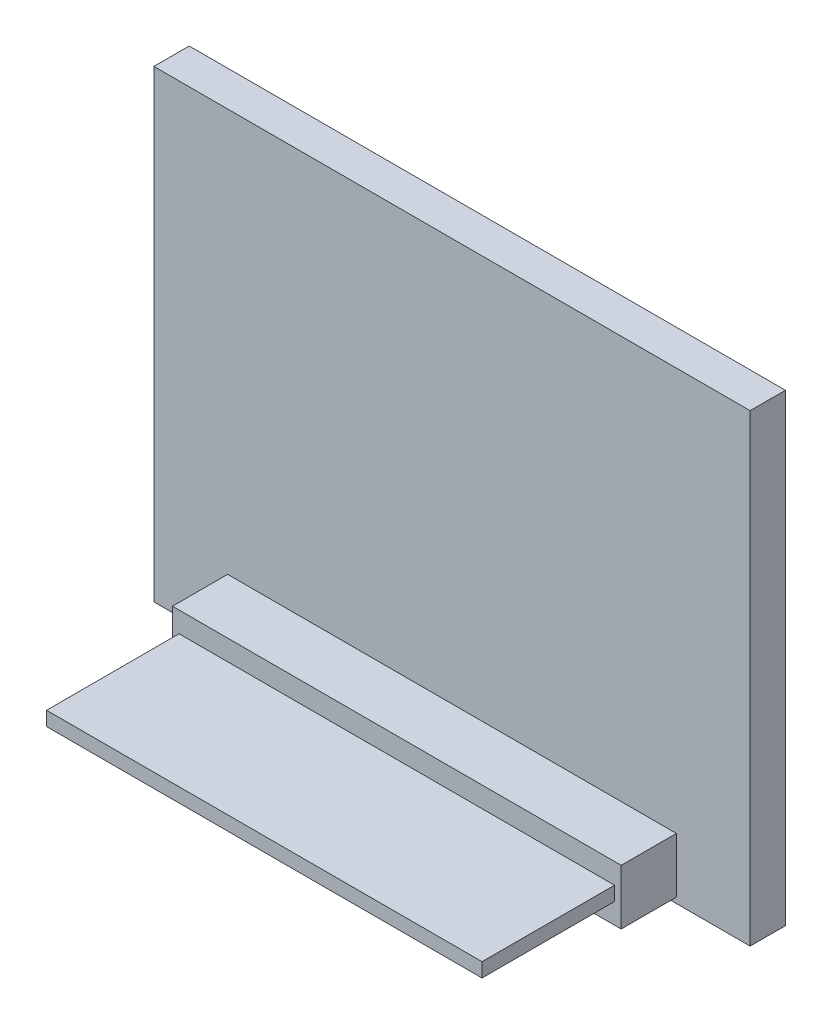
ISO-10303-21;
HEADER;
FILE_DESCRIPTION(('STEP AP214'),'2;1');
FILE_NAME('part.step','',(''),(''),'','','');
FILE_SCHEMA(('AUTOMOTIVE_DESIGN { 1 0 10303 214 1 1 1 1 }'));
ENDSEC;
DATA;
#1=APPLICATION_CONTEXT('core data for automotive mechanical design processes');
#2=APPLICATION_PROTOCOL_DEFINITION('international standard','automotive_design',2000,#1);
#3=PRODUCT_CONTEXT('',#1,'mechanical');
#4=PRODUCT('Part','Part','',(#3));
#5=PRODUCT_RELATED_PRODUCT_CATEGORY('part','',(#4));
#6=PRODUCT_DEFINITION_FORMATION('','',#4);
#7=PRODUCT_DEFINITION_CONTEXT('part definition',#1,'design');
#8=PRODUCT_DEFINITION('design','',#6,#7);
#9=PRODUCT_DEFINITION_SHAPE('','',#8);
#10=(LENGTH_UNIT() NAMED_UNIT(*) SI_UNIT(.MILLI.,.METRE.));
#11=(NAMED_UNIT(*) PLANE_ANGLE_UNIT() SI_UNIT($,.RADIAN.));
#12=(NAMED_UNIT(*) SI_UNIT($,.STERADIAN.) SOLID_ANGLE_UNIT());
#13=UNCERTAINTY_MEASURE_WITH_UNIT(LENGTH_MEASURE(1.E-05),#10,'distance_accuracy_value','');
#14=(GEOMETRIC_REPRESENTATION_CONTEXT(3) GLOBAL_UNCERTAINTY_ASSIGNED_CONTEXT((#13)) GLOBAL_UNIT_ASSIGNED_CONTEXT((#10,
#11,#12)) REPRESENTATION_CONTEXT('',''));
#15=CARTESIAN_POINT('',(0.,0.,0.));
#16=DIRECTION('',(0.,0.,1.));
#17=DIRECTION('',(1.,0.,0.));
#18=AXIS2_PLACEMENT_3D('',#15,#16,#17);
#19=CARTESIAN_POINT('',(-9.86,-9.32,10.1));
#20=DIRECTION('',(0.,0.,1.));
#21=DIRECTION('',(1.,0.,0.));
#22=AXIS2_PLACEMENT_3D('',#19,#20,#21);
#23=PLANE('',#22);
#24=DIRECTION('',(0.,1.,0.));
#25=VECTOR('',#24,1.);
#26=CARTESIAN_POINT('',(-9.86,-9.32,10.1));
#27=LINE('',#26,#25);
#28=CARTESIAN_POINT('',(-9.86,-9.32,10.1));
#29=VERTEX_POINT('',#28);
#30=CARTESIAN_POINT('',(-9.86,-8.68,10.1));
#31=VERTEX_POINT('',#30);
#32=EDGE_CURVE('E11',#29,#31,#27,.T.);
#33=ORIENTED_EDGE('',*,*,#32,.F.);
#34=DIRECTION('',(1.,0.,0.));
#35=VECTOR('',#34,1.);
#36=CARTESIAN_POINT('',(-9.86,-9.32,10.1));
#37=LINE('',#36,#35);
#38=CARTESIAN_POINT('',(9.86,-9.32,10.1));
#39=VERTEX_POINT('',#38);
#40=EDGE_CURVE('E405',#29,#39,#37,.T.);
#41=ORIENTED_EDGE('',*,*,#40,.T.);
#42=DIRECTION('',(0.,1.,0.));
#43=VECTOR('',#42,1.);
#44=CARTESIAN_POINT('',(9.86,-9.32,10.1));
#45=LINE('',#44,#43);
#46=CARTESIAN_POINT('',(9.86,-8.68,10.1));
#47=VERTEX_POINT('',#46);
#48=EDGE_CURVE('E308',#39,#47,#45,.T.);
#49=ORIENTED_EDGE('',*,*,#48,.T.);
#50=DIRECTION('',(1.,0.,0.));
#51=VECTOR('',#50,1.);
#52=CARTESIAN_POINT('',(-9.86,-8.68,10.1));
#53=LINE('',#52,#51);
#54=EDGE_CURVE('E25',#31,#47,#53,.T.);
#55=ORIENTED_EDGE('',*,*,#54,.F.);
#56=EDGE_LOOP('',(#33,#41,#49,#55));
#57=FACE_BOUND('',#56,.T.);
#58=ADVANCED_FACE('F17',(#57),#23,.T.);
#59=CARTESIAN_POINT('',(-9.86,-9.32,-3.));
#60=DIRECTION('',(1.,0.,0.));
#61=DIRECTION('',(0.,1.,0.));
#62=AXIS2_PLACEMENT_3D('',#59,#60,#61);
#63=PLANE('',#62);
#64=ORIENTED_EDGE('',*,*,#32,.T.);
#65=DIRECTION('',(0.,0.,1.));
#66=VECTOR('',#65,1.);
#67=CARTESIAN_POINT('',(-9.86,-8.68,-3.));
#68=LINE('',#67,#66);
#69=CARTESIAN_POINT('',(-9.86,-8.68,4.1));
#70=VERTEX_POINT('',#69);
#71=EDGE_CURVE('E271',#70,#31,#68,.T.);
#72=ORIENTED_EDGE('',*,*,#71,.F.);
#73=DIRECTION('',(0.,1.,0.));
#74=VECTOR('',#73,1.);
#75=CARTESIAN_POINT('',(-9.86,-9.785,4.1));
#76=LINE('',#75,#74);
#77=CARTESIAN_POINT('',(-9.86,-9.32,4.1));
#78=VERTEX_POINT('',#77);
#79=EDGE_CURVE('E277',#78,#70,#76,.T.);
#80=ORIENTED_EDGE('',*,*,#79,.F.);
#81=DIRECTION('',(0.,0.,1.));
#82=VECTOR('',#81,1.);
#83=CARTESIAN_POINT('',(-9.86,-9.32,-3.));
#84=LINE('',#83,#82);
#85=EDGE_CURVE('E409',#78,#29,#84,.T.);
#86=ORIENTED_EDGE('',*,*,#85,.T.);
#87=EDGE_LOOP('',(#64,#72,#80,#86));
#88=FACE_BOUND('',#87,.T.);
#89=ADVANCED_FACE('F419',(#88),#63,.F.);
#90=CARTESIAN_POINT('',(-9.86,-8.68,-3.));
#91=DIRECTION('',(0.,1.,0.));
#92=DIRECTION('',(1.,0.,0.));
#93=AXIS2_PLACEMENT_3D('',#90,#91,#92);
#94=PLANE('',#93);
#95=DIRECTION('',(0.,0.,1.));
#96=VECTOR('',#95,1.);
#97=CARTESIAN_POINT('',(9.86,-8.68,-3.));
#98=LINE('',#97,#96);
#99=CARTESIAN_POINT('',(9.86,-8.68,4.1));
#100=VERTEX_POINT('',#99);
#101=EDGE_CURVE('E304',#100,#47,#98,.T.);
#102=ORIENTED_EDGE('',*,*,#101,.F.);
#103=DIRECTION('',(-1.,0.,0.));
#104=VECTOR('',#103,1.);
#105=CARTESIAN_POINT('',(-10.01,-8.68,4.1));
#106=LINE('',#105,#104);
#107=EDGE_CURVE('E272',#100,#70,#106,.T.);
#108=ORIENTED_EDGE('',*,*,#107,.T.);
#109=ORIENTED_EDGE('',*,*,#71,.T.);
#110=ORIENTED_EDGE('',*,*,#54,.T.);
#111=EDGE_LOOP('',(#102,#108,#109,#110));
#112=FACE_BOUND('',#111,.T.);
#113=ADVANCED_FACE('F416',(#112),#94,.T.);
#114=CARTESIAN_POINT('',(9.86,-9.32,-3.));
#115=DIRECTION('',(1.,0.,0.));
#116=DIRECTION('',(0.,1.,0.));
#117=AXIS2_PLACEMENT_3D('',#114,#115,#116);
#118=PLANE('',#117);
#119=DIRECTION('',(0.,0.,1.));
#120=VECTOR('',#119,1.);
#121=CARTESIAN_POINT('',(9.86,-9.32,-3.));
#122=LINE('',#121,#120);
#123=CARTESIAN_POINT('',(9.86,-9.32,4.1));
#124=VERTEX_POINT('',#123);
#125=EDGE_CURVE('E309',#124,#39,#122,.T.);
#126=ORIENTED_EDGE('',*,*,#125,.F.);
#127=DIRECTION('',(0.,1.,0.));
#128=VECTOR('',#127,1.);
#129=CARTESIAN_POINT('',(9.86,-9.785,4.1));
#130=LINE('',#129,#128);
#131=EDGE_CURVE('E276',#124,#100,#130,.T.);
#132=ORIENTED_EDGE('',*,*,#131,.T.);
#133=ORIENTED_EDGE('',*,*,#101,.T.);
#134=ORIENTED_EDGE('',*,*,#48,.F.);
#135=EDGE_LOOP('',(#126,#132,#133,#134));
#136=FACE_BOUND('',#135,.T.);
#137=ADVANCED_FACE('F430',(#136),#118,.T.);
#138=CARTESIAN_POINT('',(-9.86,-9.32,-3.));
#139=DIRECTION('',(0.,1.,0.));
#140=DIRECTION('',(1.,0.,0.));
#141=AXIS2_PLACEMENT_3D('',#138,#139,#140);
#142=PLANE('',#141);
#143=ORIENTED_EDGE('',*,*,#40,.F.);
#144=ORIENTED_EDGE('',*,*,#85,.F.);
#145=DIRECTION('',(-1.,0.,0.));
#146=VECTOR('',#145,1.);
#147=CARTESIAN_POINT('',(-10.01,-9.32,4.1));
#148=LINE('',#147,#146);
#149=EDGE_CURVE('E395',#124,#78,#148,.T.);
#150=ORIENTED_EDGE('',*,*,#149,.F.);
#151=ORIENTED_EDGE('',*,*,#125,.T.);
#152=EDGE_LOOP('',(#143,#144,#150,#151));
#153=FACE_BOUND('',#152,.T.);
#154=ADVANCED_FACE('F427',(#153),#142,.F.);
#155=CARTESIAN_POINT('',(-2.6,-1.9,-1.1));
#156=DIRECTION('',(0.,0.,1.));
#157=DIRECTION('',(1.,0.,0.));
#158=AXIS2_PLACEMENT_3D('',#155,#156,#157);
#159=PLANE('',#158);
#160=DIRECTION('',(1.,0.,0.));
#161=VECTOR('',#160,1.);
#162=CARTESIAN_POINT('',(-2.6,1.9,-1.1));
#163=LINE('',#162,#161);
#164=CARTESIAN_POINT('',(-2.6,1.9,-1.1));
#165=VERTEX_POINT('',#164);
#166=CARTESIAN_POINT('',(2.6,1.9,-1.1));
#167=VERTEX_POINT('',#166);
#168=EDGE_CURVE('E263',#165,#167,#163,.T.);
#169=ORIENTED_EDGE('',*,*,#168,.T.);
#170=DIRECTION('',(0.,1.,0.));
#171=VECTOR('',#170,1.);
#172=CARTESIAN_POINT('',(2.6,-1.9,-1.1));
#173=LINE('',#172,#171);
#174=CARTESIAN_POINT('',(2.6,-1.9,-1.1));
#175=VERTEX_POINT('',#174);
#176=EDGE_CURVE('E392',#175,#167,#173,.T.);
#177=ORIENTED_EDGE('',*,*,#176,.F.);
#178=DIRECTION('',(1.,0.,0.));
#179=VECTOR('',#178,1.);
#180=CARTESIAN_POINT('',(-2.6,-1.9,-1.1));
#181=LINE('',#180,#179);
#182=CARTESIAN_POINT('',(-2.6,-1.9,-1.1));
#183=VERTEX_POINT('',#182);
#184=EDGE_CURVE('E323',#183,#175,#181,.T.);
#185=ORIENTED_EDGE('',*,*,#184,.F.);
#186=DIRECTION('',(0.,1.,0.));
#187=VECTOR('',#186,1.);
#188=CARTESIAN_POINT('',(-2.6,-1.9,-1.1));
#189=LINE('',#188,#187);
#190=EDGE_CURVE('E264',#183,#165,#189,.T.);
#191=ORIENTED_EDGE('',*,*,#190,.T.);
#192=EDGE_LOOP('',(#169,#177,#185,#191));
#193=FACE_BOUND('',#192,.T.);
#194=ADVANCED_FACE('F438',(#193),#159,.F.);
#195=CARTESIAN_POINT('',(-9.86,-9.32,-3.));
#196=DIRECTION('',(0.,0.,1.));
#197=DIRECTION('',(1.,0.,0.));
#198=AXIS2_PLACEMENT_3D('',#195,#196,#197);
#199=PLANE('',#198);
#200=DIRECTION('',(1.,0.,0.));
#201=VECTOR('',#200,1.);
#202=CARTESIAN_POINT('',(-9.86,-8.68,-3.));
#203=LINE('',#202,#201);
#204=CARTESIAN_POINT('',(-9.86,-8.68,-3.));
#205=VERTEX_POINT('',#204);
#206=CARTESIAN_POINT('',(9.86,-8.68,-3.));
#207=VERTEX_POINT('',#206);
#208=EDGE_CURVE('E361',#205,#207,#203,.T.);
#209=ORIENTED_EDGE('',*,*,#208,.T.);
#210=DIRECTION('',(0.,1.,0.));
#211=VECTOR('',#210,1.);
#212=CARTESIAN_POINT('',(9.86,-9.32,-3.));
#213=LINE('',#212,#211);
#214=CARTESIAN_POINT('',(9.86,-9.32,-3.));
#215=VERTEX_POINT('',#214);
#216=EDGE_CURVE('E368',#215,#207,#213,.T.);
#217=ORIENTED_EDGE('',*,*,#216,.F.);
#218=DIRECTION('',(1.,0.,0.));
#219=VECTOR('',#218,1.);
#220=CARTESIAN_POINT('',(-9.86,-9.32,-3.));
#221=LINE('',#220,#219);
#222=CARTESIAN_POINT('',(-9.86,-9.32,-3.));
#223=VERTEX_POINT('',#222);
#224=EDGE_CURVE('E356',#223,#215,#221,.T.);
#225=ORIENTED_EDGE('',*,*,#224,.F.);
#226=DIRECTION('',(0.,1.,0.));
#227=VECTOR('',#226,1.);
#228=CARTESIAN_POINT('',(-9.86,-9.32,-3.));
#229=LINE('',#228,#227);
#230=EDGE_CURVE('E378',#223,#205,#229,.T.);
#231=ORIENTED_EDGE('',*,*,#230,.T.);
#232=EDGE_LOOP('',(#209,#217,#225,#231));
#233=FACE_BOUND('',#232,.T.);
#234=ADVANCED_FACE('F484',(#233),#199,.F.);
#235=CARTESIAN_POINT('',(-10.16,-10.25,4.1));
#236=DIRECTION('',(0.,0.,1.));
#237=DIRECTION('',(1.,0.,0.));
#238=AXIS2_PLACEMENT_3D('',#235,#236,#237);
#239=PLANE('',#238);
#240=ORIENTED_EDGE('',*,*,#149,.T.);
#241=ORIENTED_EDGE('',*,*,#79,.T.);
#242=ORIENTED_EDGE('',*,*,#107,.F.);
#243=ORIENTED_EDGE('',*,*,#131,.F.);
#244=EDGE_LOOP('',(#240,#241,#242,#243));
#245=FACE_BOUND('',#244,.T.);
#246=DIRECTION('',(0.,1.,0.));
#247=VECTOR('',#246,1.);
#248=CARTESIAN_POINT('',(-10.16,-10.25,4.1));
#249=LINE('',#248,#247);
#250=CARTESIAN_POINT('',(-10.16,-10.25,4.1));
#251=VERTEX_POINT('',#250);
#252=CARTESIAN_POINT('',(-10.16,-7.75,4.1));
#253=VERTEX_POINT('',#252);
#254=EDGE_CURVE('E336',#251,#253,#249,.T.);
#255=ORIENTED_EDGE('',*,*,#254,.F.);
#256=DIRECTION('',(1.,0.,0.));
#257=VECTOR('',#256,1.);
#258=CARTESIAN_POINT('',(-10.16,-10.25,4.1));
#259=LINE('',#258,#257);
#260=CARTESIAN_POINT('',(10.16,-10.25,4.1));
#261=VERTEX_POINT('',#260);
#262=EDGE_CURVE('E209',#251,#261,#259,.T.);
#263=ORIENTED_EDGE('',*,*,#262,.T.);
#264=DIRECTION('',(0.,1.,0.));
#265=VECTOR('',#264,1.);
#266=CARTESIAN_POINT('',(10.16,-10.25,4.1));
#267=LINE('',#266,#265);
#268=CARTESIAN_POINT('',(10.16,-7.75,4.1));
#269=VERTEX_POINT('',#268);
#270=EDGE_CURVE('E205',#261,#269,#267,.T.);
#271=ORIENTED_EDGE('',*,*,#270,.T.);
#272=DIRECTION('',(1.,0.,0.));
#273=VECTOR('',#272,1.);
#274=CARTESIAN_POINT('',(-10.16,-7.75,4.1));
#275=LINE('',#274,#273);
#276=EDGE_CURVE('E350',#253,#269,#275,.T.);
#277=ORIENTED_EDGE('',*,*,#276,.F.);
#278=EDGE_LOOP('',(#255,#263,#271,#277));
#279=FACE_BOUND('',#278,.T.);
#280=ADVANCED_FACE('F424',(#245,#279),#239,.T.);
#281=CARTESIAN_POINT('',(2.6,-1.9,-1.1));
#282=DIRECTION('',(1.,0.,0.));
#283=DIRECTION('',(0.,1.,0.));
#284=AXIS2_PLACEMENT_3D('',#281,#282,#283);
#285=PLANE('',#284);
#286=DIRECTION('',(0.,0.,1.));
#287=VECTOR('',#286,1.);
#288=CARTESIAN_POINT('',(2.6,-1.9,-1.1));
#289=LINE('',#288,#287);
#290=CARTESIAN_POINT('',(2.6,-1.9,0.));
#291=VERTEX_POINT('',#290);
#292=EDGE_CURVE('E320',#175,#291,#289,.T.);
#293=ORIENTED_EDGE('',*,*,#292,.F.);
#294=ORIENTED_EDGE('',*,*,#176,.T.);
#295=DIRECTION('',(0.,0.,1.));
#296=VECTOR('',#295,1.);
#297=CARTESIAN_POINT('',(2.6,1.9,-1.1));
#298=LINE('',#297,#296);
#299=CARTESIAN_POINT('',(2.6,1.9,0.));
#300=VERTEX_POINT('',#299);
#301=EDGE_CURVE('E324',#167,#300,#298,.T.);
#302=ORIENTED_EDGE('',*,*,#301,.T.);
#303=DIRECTION('',(0.,1.,0.));
#304=VECTOR('',#303,1.);
#305=CARTESIAN_POINT('',(2.6,-1.9,0.));
#306=LINE('',#305,#304);
#307=EDGE_CURVE('E290',#291,#300,#306,.T.);
#308=ORIENTED_EDGE('',*,*,#307,.F.);
#309=EDGE_LOOP('',(#293,#294,#302,#308));
#310=FACE_BOUND('',#309,.T.);
#311=ADVANCED_FACE('F477',(#310),#285,.T.);
#312=CARTESIAN_POINT('',(-2.6,-1.9,-1.1));
#313=DIRECTION('',(0.,1.,0.));
#314=DIRECTION('',(1.,0.,0.));
#315=AXIS2_PLACEMENT_3D('',#312,#313,#314);
#316=PLANE('',#315);
#317=ORIENTED_EDGE('',*,*,#292,.T.);
#318=DIRECTION('',(1.,0.,0.));
#319=VECTOR('',#318,1.);
#320=CARTESIAN_POINT('',(-2.6,-1.9,0.));
#321=LINE('',#320,#319);
#322=CARTESIAN_POINT('',(-2.6,-1.9,0.));
#323=VERTEX_POINT('',#322);
#324=EDGE_CURVE('E286',#323,#291,#321,.T.);
#325=ORIENTED_EDGE('',*,*,#324,.F.);
#326=DIRECTION('',(0.,0.,1.));
#327=VECTOR('',#326,1.);
#328=CARTESIAN_POINT('',(-2.6,-1.9,-1.1));
#329=LINE('',#328,#327);
#330=EDGE_CURVE('E260',#183,#323,#329,.T.);
#331=ORIENTED_EDGE('',*,*,#330,.F.);
#332=ORIENTED_EDGE('',*,*,#184,.T.);
#333=EDGE_LOOP('',(#317,#325,#331,#332));
#334=FACE_BOUND('',#333,.T.);
#335=ADVANCED_FACE('F473',(#334),#316,.F.);
#336=CARTESIAN_POINT('',(-2.6,1.9,-1.1));
#337=DIRECTION('',(0.,1.,0.));
#338=DIRECTION('',(1.,0.,0.));
#339=AXIS2_PLACEMENT_3D('',#336,#337,#338);
#340=PLANE('',#339);
#341=ORIENTED_EDGE('',*,*,#168,.F.);
#342=DIRECTION('',(0.,0.,1.));
#343=VECTOR('',#342,1.);
#344=CARTESIAN_POINT('',(-2.6,1.9,-1.1));
#345=LINE('',#344,#343);
#346=CARTESIAN_POINT('',(-2.6,1.9,0.));
#347=VERTEX_POINT('',#346);
#348=EDGE_CURVE('E236',#165,#347,#345,.T.);
#349=ORIENTED_EDGE('',*,*,#348,.T.);
#350=DIRECTION('',(1.,0.,0.));
#351=VECTOR('',#350,1.);
#352=CARTESIAN_POINT('',(-2.6,1.9,0.));
#353=LINE('',#352,#351);
#354=EDGE_CURVE('E328',#347,#300,#353,.T.);
#355=ORIENTED_EDGE('',*,*,#354,.T.);
#356=ORIENTED_EDGE('',*,*,#301,.F.);
#357=EDGE_LOOP('',(#341,#349,#355,#356));
#358=FACE_BOUND('',#357,.T.);
#359=ADVANCED_FACE('F469',(#358),#340,.T.);
#360=CARTESIAN_POINT('',(-2.6,-1.9,-1.1));
#361=DIRECTION('',(1.,0.,0.));
#362=DIRECTION('',(0.,1.,0.));
#363=AXIS2_PLACEMENT_3D('',#360,#361,#362);
#364=PLANE('',#363);
#365=DIRECTION('',(0.,1.,0.));
#366=VECTOR('',#365,1.);
#367=CARTESIAN_POINT('',(-2.6,-1.9,0.));
#368=LINE('',#367,#366);
#369=EDGE_CURVE('E332',#323,#347,#368,.T.);
#370=ORIENTED_EDGE('',*,*,#369,.T.);
#371=ORIENTED_EDGE('',*,*,#348,.F.);
#372=ORIENTED_EDGE('',*,*,#190,.F.);
#373=ORIENTED_EDGE('',*,*,#330,.T.);
#374=EDGE_LOOP('',(#370,#371,#372,#373));
#375=FACE_BOUND('',#374,.T.);
#376=ADVANCED_FACE('F465',(#375),#364,.F.);
#377=CARTESIAN_POINT('',(-9.86,-9.32,-3.));
#378=DIRECTION('',(1.,0.,0.));
#379=DIRECTION('',(0.,1.,0.));
#380=AXIS2_PLACEMENT_3D('',#377,#378,#379);
#381=PLANE('',#380);
#382=DIRECTION('',(0.,1.,0.));
#383=VECTOR('',#382,1.);
#384=CARTESIAN_POINT('',(-9.86,-9.91,0.));
#385=LINE('',#384,#383);
#386=CARTESIAN_POINT('',(-9.86,-9.32,0.));
#387=VERTEX_POINT('',#386);
#388=CARTESIAN_POINT('',(-9.86,-8.68,0.));
#389=VERTEX_POINT('',#388);
#390=EDGE_CURVE('E313',#387,#389,#385,.T.);
#391=ORIENTED_EDGE('',*,*,#390,.T.);
#392=DIRECTION('',(0.,0.,1.));
#393=VECTOR('',#392,1.);
#394=CARTESIAN_POINT('',(-9.86,-8.68,-3.));
#395=LINE('',#394,#393);
#396=EDGE_CURVE('E364',#205,#389,#395,.T.);
#397=ORIENTED_EDGE('',*,*,#396,.F.);
#398=ORIENTED_EDGE('',*,*,#230,.F.);
#399=DIRECTION('',(0.,0.,1.));
#400=VECTOR('',#399,1.);
#401=CARTESIAN_POINT('',(-9.86,-9.32,-3.));
#402=LINE('',#401,#400);
#403=EDGE_CURVE('E353',#223,#387,#402,.T.);
#404=ORIENTED_EDGE('',*,*,#403,.T.);
#405=EDGE_LOOP('',(#391,#397,#398,#404));
#406=FACE_BOUND('',#405,.T.);
#407=ADVANCED_FACE('F461',(#406),#381,.F.);
#408=CARTESIAN_POINT('',(-9.86,-8.68,-3.));
#409=DIRECTION('',(0.,1.,0.));
#410=DIRECTION('',(1.,0.,0.));
#411=AXIS2_PLACEMENT_3D('',#408,#409,#410);
#412=PLANE('',#411);
#413=DIRECTION('',(0.,0.,1.));
#414=VECTOR('',#413,1.);
#415=CARTESIAN_POINT('',(9.86,-8.68,-3.));
#416=LINE('',#415,#414);
#417=CARTESIAN_POINT('',(9.86,-8.68,0.));
#418=VERTEX_POINT('',#417);
#419=EDGE_CURVE('E365',#207,#418,#416,.T.);
#420=ORIENTED_EDGE('',*,*,#419,.F.);
#421=ORIENTED_EDGE('',*,*,#208,.F.);
#422=ORIENTED_EDGE('',*,*,#396,.T.);
#423=DIRECTION('',(-1.,0.,0.));
#424=VECTOR('',#423,1.);
#425=CARTESIAN_POINT('',(-11.68,-8.68,0.));
#426=LINE('',#425,#424);
#427=EDGE_CURVE('E303',#418,#389,#426,.T.);
#428=ORIENTED_EDGE('',*,*,#427,.F.);
#429=EDGE_LOOP('',(#420,#421,#422,#428));
#430=FACE_BOUND('',#429,.T.);
#431=ADVANCED_FACE('F457',(#430),#412,.T.);
#432=CARTESIAN_POINT('',(9.86,-9.32,-3.));
#433=DIRECTION('',(1.,0.,0.));
#434=DIRECTION('',(0.,1.,0.));
#435=AXIS2_PLACEMENT_3D('',#432,#433,#434);
#436=PLANE('',#435);
#437=DIRECTION('',(0.,0.,1.));
#438=VECTOR('',#437,1.);
#439=CARTESIAN_POINT('',(9.86,-9.32,-3.));
#440=LINE('',#439,#438);
#441=CARTESIAN_POINT('',(9.86,-9.32,0.));
#442=VERTEX_POINT('',#441);
#443=EDGE_CURVE('E360',#215,#442,#440,.T.);
#444=ORIENTED_EDGE('',*,*,#443,.F.);
#445=ORIENTED_EDGE('',*,*,#216,.T.);
#446=ORIENTED_EDGE('',*,*,#419,.T.);
#447=DIRECTION('',(0.,1.,0.));
#448=VECTOR('',#447,1.);
#449=CARTESIAN_POINT('',(9.86,-9.91,0.));
#450=LINE('',#449,#448);
#451=EDGE_CURVE('E295',#442,#418,#450,.T.);
#452=ORIENTED_EDGE('',*,*,#451,.F.);
#453=EDGE_LOOP('',(#444,#445,#446,#452));
#454=FACE_BOUND('',#453,.T.);
#455=ADVANCED_FACE('F453',(#454),#436,.T.);
#456=CARTESIAN_POINT('',(-9.86,-9.32,-3.));
#457=DIRECTION('',(0.,1.,0.));
#458=DIRECTION('',(1.,0.,0.));
#459=AXIS2_PLACEMENT_3D('',#456,#457,#458);
#460=PLANE('',#459);
#461=DIRECTION('',(-1.,0.,0.));
#462=VECTOR('',#461,1.);
#463=CARTESIAN_POINT('',(-11.68,-9.32,0.));
#464=LINE('',#463,#462);
#465=EDGE_CURVE('E291',#442,#387,#464,.T.);
#466=ORIENTED_EDGE('',*,*,#465,.T.);
#467=ORIENTED_EDGE('',*,*,#403,.F.);
#468=ORIENTED_EDGE('',*,*,#224,.T.);
#469=ORIENTED_EDGE('',*,*,#443,.T.);
#470=EDGE_LOOP('',(#466,#467,#468,#469));
#471=FACE_BOUND('',#470,.T.);
#472=ADVANCED_FACE('F456',(#471),#460,.F.);
#473=CARTESIAN_POINT('',(-10.16,-7.75,1.6));
#474=DIRECTION('',(0.,1.,0.));
#475=DIRECTION('',(1.,0.,0.));
#476=AXIS2_PLACEMENT_3D('',#473,#474,#475);
#477=PLANE('',#476);
#478=DIRECTION('',(1.,0.,0.));
#479=VECTOR('',#478,1.);
#480=CARTESIAN_POINT('',(-10.16,-7.75,1.6));
#481=LINE('',#480,#479);
#482=CARTESIAN_POINT('',(-10.16,-7.75,1.6));
#483=VERTEX_POINT('',#482);
#484=CARTESIAN_POINT('',(10.16,-7.75,1.6));
#485=VERTEX_POINT('',#484);
#486=EDGE_CURVE('E225',#483,#485,#481,.T.);
#487=ORIENTED_EDGE('',*,*,#486,.F.);
#488=DIRECTION('',(0.,0.,1.));
#489=VECTOR('',#488,1.);
#490=CARTESIAN_POINT('',(-10.16,-7.75,1.6));
#491=LINE('',#490,#489);
#492=EDGE_CURVE('E340',#483,#253,#491,.T.);
#493=ORIENTED_EDGE('',*,*,#492,.T.);
#494=ORIENTED_EDGE('',*,*,#276,.T.);
#495=DIRECTION('',(0.,0.,1.));
#496=VECTOR('',#495,1.);
#497=CARTESIAN_POINT('',(10.16,-7.75,1.6));
#498=LINE('',#497,#496);
#499=EDGE_CURVE('E345',#485,#269,#498,.T.);
#500=ORIENTED_EDGE('',*,*,#499,.F.);
#501=EDGE_LOOP('',(#487,#493,#494,#500));
#502=FACE_BOUND('',#501,.T.);
#503=ADVANCED_FACE('F452',(#502),#477,.T.);
#504=CARTESIAN_POINT('',(10.16,-10.25,1.6));
#505=DIRECTION('',(1.,0.,0.));
#506=DIRECTION('',(0.,1.,0.));
#507=AXIS2_PLACEMENT_3D('',#504,#505,#506);
#508=PLANE('',#507);
#509=DIRECTION('',(0.,0.,1.));
#510=VECTOR('',#509,1.);
#511=CARTESIAN_POINT('',(10.16,-10.25,1.6));
#512=LINE('',#511,#510);
#513=CARTESIAN_POINT('',(10.16,-10.25,1.6));
#514=VERTEX_POINT('',#513);
#515=EDGE_CURVE('E197',#514,#261,#512,.T.);
#516=ORIENTED_EDGE('',*,*,#515,.F.);
#517=DIRECTION('',(0.,1.,0.));
#518=VECTOR('',#517,1.);
#519=CARTESIAN_POINT('',(10.16,-10.25,1.6));
#520=LINE('',#519,#518);
#521=EDGE_CURVE('E202',#514,#485,#520,.T.);
#522=ORIENTED_EDGE('',*,*,#521,.T.);
#523=ORIENTED_EDGE('',*,*,#499,.T.);
#524=ORIENTED_EDGE('',*,*,#270,.F.);
#525=EDGE_LOOP('',(#516,#522,#523,#524));
#526=FACE_BOUND('',#525,.T.);
#527=ADVANCED_FACE('F199',(#526),#508,.T.);
#528=CARTESIAN_POINT('',(-10.16,-10.25,1.6));
#529=DIRECTION('',(0.,1.,0.));
#530=DIRECTION('',(1.,0.,0.));
#531=AXIS2_PLACEMENT_3D('',#528,#529,#530);
#532=PLANE('',#531);
#533=ORIENTED_EDGE('',*,*,#515,.T.);
#534=ORIENTED_EDGE('',*,*,#262,.F.);
#535=DIRECTION('',(0.,0.,1.));
#536=VECTOR('',#535,1.);
#537=CARTESIAN_POINT('',(-10.16,-10.25,1.6));
#538=LINE('',#537,#536);
#539=CARTESIAN_POINT('',(-10.16,-10.25,1.6));
#540=VERTEX_POINT('',#539);
#541=EDGE_CURVE('E210',#540,#251,#538,.T.);
#542=ORIENTED_EDGE('',*,*,#541,.F.);
#543=DIRECTION('',(1.,0.,0.));
#544=VECTOR('',#543,1.);
#545=CARTESIAN_POINT('',(-10.16,-10.25,1.6));
#546=LINE('',#545,#544);
#547=EDGE_CURVE('E213',#540,#514,#546,.T.);
#548=ORIENTED_EDGE('',*,*,#547,.T.);
#549=EDGE_LOOP('',(#533,#534,#542,#548));
#550=FACE_BOUND('',#549,.T.);
#551=ADVANCED_FACE('F214',(#550),#532,.F.);
#552=CARTESIAN_POINT('',(-10.16,-10.25,1.6));
#553=DIRECTION('',(1.,0.,0.));
#554=DIRECTION('',(0.,1.,0.));
#555=AXIS2_PLACEMENT_3D('',#552,#553,#554);
#556=PLANE('',#555);
#557=ORIENTED_EDGE('',*,*,#254,.T.);
#558=ORIENTED_EDGE('',*,*,#492,.F.);
#559=DIRECTION('',(0.,1.,0.));
#560=VECTOR('',#559,1.);
#561=CARTESIAN_POINT('',(-10.16,-10.25,1.6));
#562=LINE('',#561,#560);
#563=EDGE_CURVE('E232',#540,#483,#562,.T.);
#564=ORIENTED_EDGE('',*,*,#563,.F.);
#565=ORIENTED_EDGE('',*,*,#541,.T.);
#566=EDGE_LOOP('',(#557,#558,#564,#565));
#567=FACE_BOUND('',#566,.T.);
#568=ADVANCED_FACE('F537',(#567),#556,.F.);
#569=CARTESIAN_POINT('',(13.5,-10.5,0.));
#570=DIRECTION('',(1.,0.,0.));
#571=DIRECTION('',(0.,1.,0.));
#572=AXIS2_PLACEMENT_3D('',#569,#570,#571);
#573=PLANE('',#572);
#574=DIRECTION('',(0.,0.,1.));
#575=VECTOR('',#574,1.);
#576=CARTESIAN_POINT('',(13.5,-10.5,0.));
#577=LINE('',#576,#575);
#578=CARTESIAN_POINT('',(13.5,-10.5,0.));
#579=VERTEX_POINT('',#578);
#580=CARTESIAN_POINT('',(13.5,-10.5,1.6));
#581=VERTEX_POINT('',#580);
#582=EDGE_CURVE('E250',#579,#581,#577,.T.);
#583=ORIENTED_EDGE('',*,*,#582,.F.);
#584=DIRECTION('',(0.,1.,0.));
#585=VECTOR('',#584,1.);
#586=CARTESIAN_POINT('',(13.5,-10.5,0.));
#587=LINE('',#586,#585);
#588=CARTESIAN_POINT('',(13.5,10.5,0.));
#589=VERTEX_POINT('',#588);
#590=EDGE_CURVE('E292',#579,#589,#587,.T.);
#591=ORIENTED_EDGE('',*,*,#590,.T.);
#592=DIRECTION('',(0.,0.,1.));
#593=VECTOR('',#592,1.);
#594=CARTESIAN_POINT('',(13.5,10.5,0.));
#595=LINE('',#594,#593);
#596=CARTESIAN_POINT('',(13.5,10.5,1.6));
#597=VERTEX_POINT('',#596);
#598=EDGE_CURVE('E296',#589,#597,#595,.T.);
#599=ORIENTED_EDGE('',*,*,#598,.T.);
#600=DIRECTION('',(0.,1.,0.));
#601=VECTOR('',#600,1.);
#602=CARTESIAN_POINT('',(13.5,-10.5,1.6));
#603=LINE('',#602,#601);
#604=EDGE_CURVE('E259',#581,#597,#603,.T.);
#605=ORIENTED_EDGE('',*,*,#604,.F.);
#606=EDGE_LOOP('',(#583,#591,#599,#605));
#607=FACE_BOUND('',#606,.T.);
#608=ADVANCED_FACE('F517',(#607),#573,.T.);
#609=CARTESIAN_POINT('',(-13.5,-10.5,0.));
#610=DIRECTION('',(0.,0.,1.));
#611=DIRECTION('',(1.,0.,0.));
#612=AXIS2_PLACEMENT_3D('',#609,#610,#611);
#613=PLANE('',#612);
#614=ORIENTED_EDGE('',*,*,#324,.T.);
#615=ORIENTED_EDGE('',*,*,#307,.T.);
#616=ORIENTED_EDGE('',*,*,#354,.F.);
#617=ORIENTED_EDGE('',*,*,#369,.F.);
#618=EDGE_LOOP('',(#614,#615,#616,#617));
#619=FACE_BOUND('',#618,.T.);
#620=ORIENTED_EDGE('',*,*,#451,.T.);
#621=ORIENTED_EDGE('',*,*,#427,.T.);
#622=ORIENTED_EDGE('',*,*,#390,.F.);
#623=ORIENTED_EDGE('',*,*,#465,.F.);
#624=EDGE_LOOP('',(#620,#621,#622,#623));
#625=FACE_BOUND('',#624,.T.);
#626=DIRECTION('',(1.,0.,0.));
#627=VECTOR('',#626,1.);
#628=CARTESIAN_POINT('',(-13.5,10.5,0.));
#629=LINE('',#628,#627);
#630=CARTESIAN_POINT('',(-13.5,10.5,0.));
#631=VERTEX_POINT('',#630);
#632=EDGE_CURVE('E220',#631,#589,#629,.T.);
#633=ORIENTED_EDGE('',*,*,#632,.T.);
#634=ORIENTED_EDGE('',*,*,#590,.F.);
#635=DIRECTION('',(1.,0.,0.));
#636=VECTOR('',#635,1.);
#637=CARTESIAN_POINT('',(-13.5,-10.5,0.));
#638=LINE('',#637,#636);
#639=CARTESIAN_POINT('',(-13.5,-10.5,0.));
#640=VERTEX_POINT('',#639);
#641=EDGE_CURVE('E268',#640,#579,#638,.T.);
#642=ORIENTED_EDGE('',*,*,#641,.F.);
#643=DIRECTION('',(0.,1.,0.));
#644=VECTOR('',#643,1.);
#645=CARTESIAN_POINT('',(-13.5,-10.5,0.));
#646=LINE('',#645,#644);
#647=EDGE_CURVE('E241',#640,#631,#646,.T.);
#648=ORIENTED_EDGE('',*,*,#647,.T.);
#649=EDGE_LOOP('',(#633,#634,#642,#648));
#650=FACE_BOUND('',#649,.T.);
#651=ADVANCED_FACE('F527',(#619,#625,#650),#613,.F.);
#652=CARTESIAN_POINT('',(-13.5,10.5,0.));
#653=DIRECTION('',(0.,1.,0.));
#654=DIRECTION('',(1.,0.,0.));
#655=AXIS2_PLACEMENT_3D('',#652,#653,#654);
#656=PLANE('',#655);
#657=ORIENTED_EDGE('',*,*,#632,.F.);
#658=DIRECTION('',(0.,0.,1.));
#659=VECTOR('',#658,1.);
#660=CARTESIAN_POINT('',(-13.5,10.5,0.));
#661=LINE('',#660,#659);
#662=CARTESIAN_POINT('',(-13.5,10.5,1.6));
#663=VERTEX_POINT('',#662);
#664=EDGE_CURVE('E238',#631,#663,#661,.T.);
#665=ORIENTED_EDGE('',*,*,#664,.T.);
#666=DIRECTION('',(1.,0.,0.));
#667=VECTOR('',#666,1.);
#668=CARTESIAN_POINT('',(-13.5,10.5,1.6));
#669=LINE('',#668,#667);
#670=EDGE_CURVE('E255',#663,#597,#669,.T.);
#671=ORIENTED_EDGE('',*,*,#670,.T.);
#672=ORIENTED_EDGE('',*,*,#598,.F.);
#673=EDGE_LOOP('',(#657,#665,#671,#672));
#674=FACE_BOUND('',#673,.T.);
#675=ADVANCED_FACE('F519',(#674),#656,.T.);
#676=CARTESIAN_POINT('',(-13.5,-10.5,1.6));
#677=DIRECTION('',(0.,0.,1.));
#678=DIRECTION('',(1.,0.,0.));
#679=AXIS2_PLACEMENT_3D('',#676,#677,#678);
#680=PLANE('',#679);
#681=ORIENTED_EDGE('',*,*,#563,.T.);
#682=ORIENTED_EDGE('',*,*,#486,.T.);
#683=ORIENTED_EDGE('',*,*,#521,.F.);
#684=ORIENTED_EDGE('',*,*,#547,.F.);
#685=EDGE_LOOP('',(#681,#682,#683,#684));
#686=FACE_BOUND('',#685,.T.);
#687=DIRECTION('',(0.,1.,0.));
#688=VECTOR('',#687,1.);
#689=CARTESIAN_POINT('',(-13.5,-10.5,1.6));
#690=LINE('',#689,#688);
#691=CARTESIAN_POINT('',(-13.5,-10.5,1.6));
#692=VERTEX_POINT('',#691);
#693=EDGE_CURVE('E242',#692,#663,#690,.T.);
#694=ORIENTED_EDGE('',*,*,#693,.F.);
#695=DIRECTION('',(1.,0.,0.));
#696=VECTOR('',#695,1.);
#697=CARTESIAN_POINT('',(-13.5,-10.5,1.6));
#698=LINE('',#697,#696);
#699=EDGE_CURVE('E254',#692,#581,#698,.T.);
#700=ORIENTED_EDGE('',*,*,#699,.T.);
#701=ORIENTED_EDGE('',*,*,#604,.T.);
#702=ORIENTED_EDGE('',*,*,#670,.F.);
#703=EDGE_LOOP('',(#694,#700,#701,#702));
#704=FACE_BOUND('',#703,.T.);
#705=ADVANCED_FACE('F222',(#686,#704),#680,.T.);
#706=CARTESIAN_POINT('',(-13.5,-10.5,0.));
#707=DIRECTION('',(0.,1.,0.));
#708=DIRECTION('',(1.,0.,0.));
#709=AXIS2_PLACEMENT_3D('',#706,#707,#708);
#710=PLANE('',#709);
#711=ORIENTED_EDGE('',*,*,#582,.T.);
#712=ORIENTED_EDGE('',*,*,#699,.F.);
#713=DIRECTION('',(0.,0.,1.));
#714=VECTOR('',#713,1.);
#715=CARTESIAN_POINT('',(-13.5,-10.5,0.));
#716=LINE('',#715,#714);
#717=EDGE_CURVE('E246',#640,#692,#716,.T.);
#718=ORIENTED_EDGE('',*,*,#717,.F.);
#719=ORIENTED_EDGE('',*,*,#641,.T.);
#720=EDGE_LOOP('',(#711,#712,#718,#719));
#721=FACE_BOUND('',#720,.T.);
#722=ADVANCED_FACE('F524',(#721),#710,.F.);
#723=CARTESIAN_POINT('',(-13.5,-10.5,0.));
#724=DIRECTION('',(1.,0.,0.));
#725=DIRECTION('',(0.,1.,0.));
#726=AXIS2_PLACEMENT_3D('',#723,#724,#725);
#727=PLANE('',#726);
#728=ORIENTED_EDGE('',*,*,#693,.T.);
#729=ORIENTED_EDGE('',*,*,#664,.F.);
#730=ORIENTED_EDGE('',*,*,#647,.F.);
#731=ORIENTED_EDGE('',*,*,#717,.T.);
#732=EDGE_LOOP('',(#728,#729,#730,#731));
#733=FACE_BOUND('',#732,.T.);
#734=ADVANCED_FACE('F529',(#733),#727,.F.);
#735=CLOSED_SHELL('',(#58,#89,#113,#137,#154,#194,#234,#280,#311,#335,#359,#376,#407,#431,#455,
#472,#503,#527,#551,#568,#608,#651,#675,#705,#722,#734));
#736=MANIFOLD_SOLID_BREP('B1',#735);
#737=ADVANCED_BREP_SHAPE_REPRESENTATION('',(#18,#736),#14);
#738=SHAPE_DEFINITION_REPRESENTATION(#9,#737);
ENDSEC;
END-ISO-10303-21;
